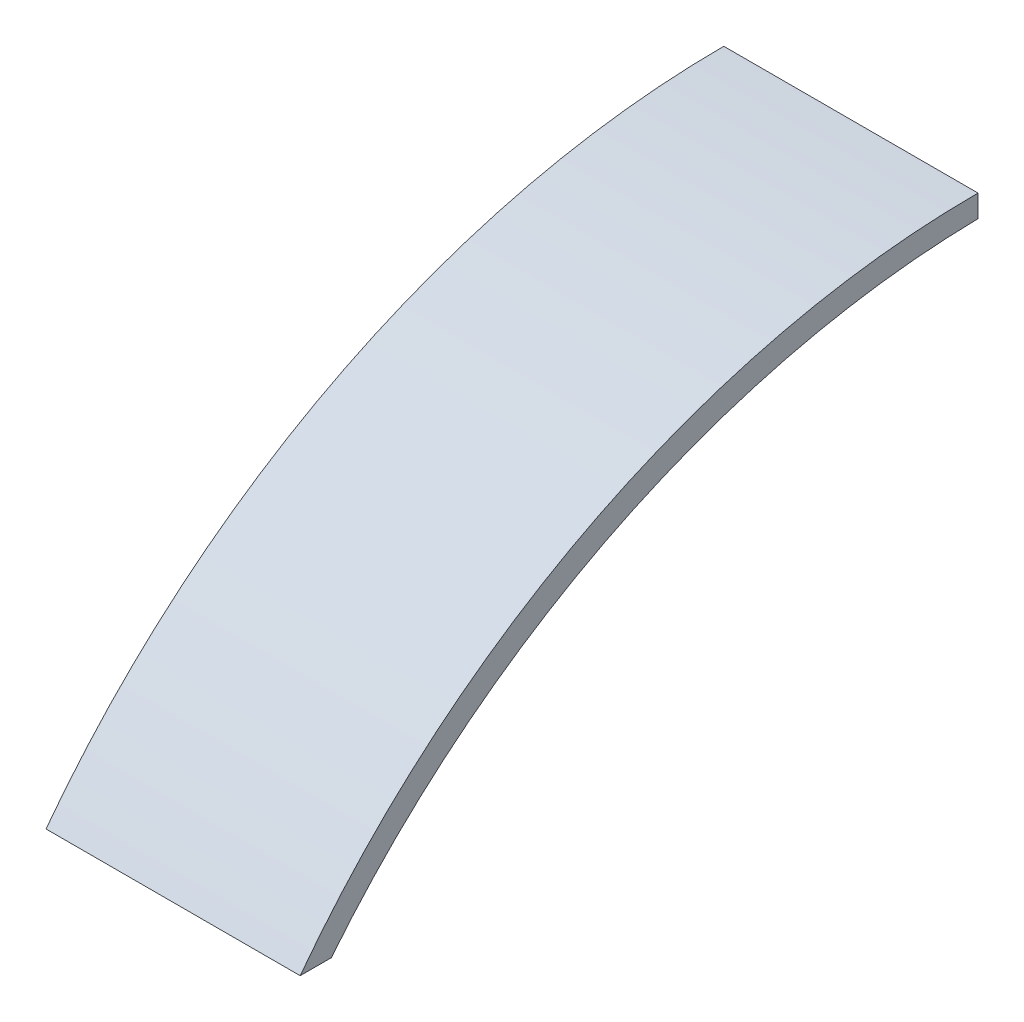
ISO-10303-21;
HEADER;
FILE_DESCRIPTION(('STEP AP214'),'2;1');
FILE_NAME('part.step','',(''),(''),'','','');
FILE_SCHEMA(('AUTOMOTIVE_DESIGN { 1 0 10303 214 1 1 1 1 }'));
ENDSEC;
DATA;
#1=APPLICATION_CONTEXT('core data for automotive mechanical design processes');
#2=APPLICATION_PROTOCOL_DEFINITION('international standard','automotive_design',2000,#1);
#3=PRODUCT_CONTEXT('',#1,'mechanical');
#4=PRODUCT('Part','Part','',(#3));
#5=PRODUCT_RELATED_PRODUCT_CATEGORY('part','',(#4));
#6=PRODUCT_DEFINITION_FORMATION('','',#4);
#7=PRODUCT_DEFINITION_CONTEXT('part definition',#1,'design');
#8=PRODUCT_DEFINITION('design','',#6,#7);
#9=PRODUCT_DEFINITION_SHAPE('','',#8);
#10=(LENGTH_UNIT() NAMED_UNIT(*) SI_UNIT(.MILLI.,.METRE.));
#11=(NAMED_UNIT(*) PLANE_ANGLE_UNIT() SI_UNIT($,.RADIAN.));
#12=(NAMED_UNIT(*) SI_UNIT($,.STERADIAN.) SOLID_ANGLE_UNIT());
#13=UNCERTAINTY_MEASURE_WITH_UNIT(LENGTH_MEASURE(1.E-05),#10,'distance_accuracy_value','');
#14=(GEOMETRIC_REPRESENTATION_CONTEXT(3) GLOBAL_UNCERTAINTY_ASSIGNED_CONTEXT((#13)) GLOBAL_UNIT_ASSIGNED_CONTEXT((#10,
#11,#12)) REPRESENTATION_CONTEXT('',''));
#15=CARTESIAN_POINT('',(0.,0.,0.));
#16=DIRECTION('',(0.,0.,1.));
#17=DIRECTION('',(1.,0.,0.));
#18=AXIS2_PLACEMENT_3D('',#15,#16,#17);
#19=CARTESIAN_POINT('',(57.15,0.,0.));
#20=DIRECTION('',(0.,1.,0.));
#21=DIRECTION('',(0.,0.,1.));
#22=AXIS2_PLACEMENT_3D('',#19,#20,#21);
#23=PLANE('',#22);
#24=DIRECTION('',(0.,0.,-1.));
#25=VECTOR('',#24,1.);
#26=CARTESIAN_POINT('',(0.,0.,0.));
#27=LINE('',#26,#25);
#28=CARTESIAN_POINT('',(0.,0.,0.));
#29=VERTEX_POINT('',#28);
#30=CARTESIAN_POINT('',(0.,0.,-7.00000000000001));
#31=VERTEX_POINT('',#30);
#32=EDGE_CURVE('E107',#29,#31,#27,.T.);
#33=ORIENTED_EDGE('',*,*,#32,.T.);
#34=DIRECTION('',(-1.,0.,0.));
#35=VECTOR('',#34,1.);
#36=CARTESIAN_POINT('',(57.15,0.,-7.00000000000001));
#37=LINE('',#36,#35);
#38=CARTESIAN_POINT('',(57.15,0.,-7.00000000000001));
#39=VERTEX_POINT('',#38);
#40=EDGE_CURVE('E11',#39,#31,#37,.T.);
#41=ORIENTED_EDGE('',*,*,#40,.F.);
#42=DIRECTION('',(0.,0.,-1.));
#43=VECTOR('',#42,1.);
#44=CARTESIAN_POINT('',(57.15,0.,0.));
#45=LINE('',#44,#43);
#46=CARTESIAN_POINT('',(57.15,0.,0.));
#47=VERTEX_POINT('',#46);
#48=EDGE_CURVE('E89',#47,#39,#45,.T.);
#49=ORIENTED_EDGE('',*,*,#48,.F.);
#50=DIRECTION('',(-1.,0.,0.));
#51=VECTOR('',#50,1.);
#52=CARTESIAN_POINT('',(57.15,0.,0.));
#53=LINE('',#52,#51);
#54=EDGE_CURVE('E56',#47,#29,#53,.T.);
#55=ORIENTED_EDGE('',*,*,#54,.T.);
#56=EDGE_LOOP('',(#33,#41,#49,#55));
#57=FACE_BOUND('',#56,.T.);
#58=ADVANCED_FACE('F39',(#57),#23,.F.);
#59=CARTESIAN_POINT('',(57.15,-119.274131121308,-155.53932693148));
#60=DIRECTION('',(-1.,0.,0.));
#61=DIRECTION('',(0.,0.,1.));
#62=AXIS2_PLACEMENT_3D('',#59,#60,#61);
#63=CYLINDRICAL_SURFACE('',#62,190.5);
#64=CARTESIAN_POINT('',(0.,-119.274131121308,-155.53932693148));
#65=DIRECTION('',(-1.,0.,0.));
#66=DIRECTION('',(0.,0.,1.));
#67=AXIS2_PLACEMENT_3D('',#64,#65,#66);
#68=CIRCLE('',#67,190.5);
#69=CARTESIAN_POINT('',(0.,71.1999999999999,-152.4));
#70=VERTEX_POINT('',#69);
#71=EDGE_CURVE('E95',#31,#70,#68,.T.);
#72=ORIENTED_EDGE('',*,*,#71,.T.);
#73=DIRECTION('',(-1.,0.,0.));
#74=VECTOR('',#73,1.);
#75=CARTESIAN_POINT('',(57.15,71.1999999999999,-152.4));
#76=LINE('',#75,#74);
#77=CARTESIAN_POINT('',(57.15,71.1999999999999,-152.4));
#78=VERTEX_POINT('',#77);
#79=EDGE_CURVE('E48',#78,#70,#76,.T.);
#80=ORIENTED_EDGE('',*,*,#79,.F.);
#81=CARTESIAN_POINT('',(57.15,-119.274131121308,-155.53932693148));
#82=DIRECTION('',(-1.,0.,0.));
#83=DIRECTION('',(0.,0.,1.));
#84=AXIS2_PLACEMENT_3D('',#81,#82,#83);
#85=CIRCLE('',#84,190.5);
#86=EDGE_CURVE('E81',#39,#78,#85,.T.);
#87=ORIENTED_EDGE('',*,*,#86,.F.);
#88=ORIENTED_EDGE('',*,*,#40,.T.);
#89=EDGE_LOOP('',(#72,#80,#87,#88));
#90=FACE_BOUND('',#89,.T.);
#91=ADVANCED_FACE('F94',(#90),#63,.F.);
#92=CARTESIAN_POINT('',(57.15,76.1999999999999,-152.4));
#93=DIRECTION('',(0.,0.,-1.));
#94=DIRECTION('',(0.,1.,0.));
#95=AXIS2_PLACEMENT_3D('',#92,#93,#94);
#96=PLANE('',#95);
#97=DIRECTION('',(0.,-1.,0.));
#98=VECTOR('',#97,1.);
#99=CARTESIAN_POINT('',(0.,76.1999999999999,-152.4));
#100=LINE('',#99,#98);
#101=CARTESIAN_POINT('',(0.,76.1999999999999,-152.4));
#102=VERTEX_POINT('',#101);
#103=EDGE_CURVE('E112',#102,#70,#100,.T.);
#104=ORIENTED_EDGE('',*,*,#103,.F.);
#105=DIRECTION('',(-1.,0.,0.));
#106=VECTOR('',#105,1.);
#107=CARTESIAN_POINT('',(57.15,76.1999999999999,-152.4));
#108=LINE('',#107,#106);
#109=CARTESIAN_POINT('',(57.15,76.1999999999999,-152.4));
#110=VERTEX_POINT('',#109);
#111=EDGE_CURVE('E70',#110,#102,#108,.T.);
#112=ORIENTED_EDGE('',*,*,#111,.F.);
#113=DIRECTION('',(0.,-1.,0.));
#114=VECTOR('',#113,1.);
#115=CARTESIAN_POINT('',(57.15,76.1999999999999,-152.4));
#116=LINE('',#115,#114);
#117=EDGE_CURVE('E88',#110,#78,#116,.T.);
#118=ORIENTED_EDGE('',*,*,#117,.T.);
#119=ORIENTED_EDGE('',*,*,#79,.T.);
#120=EDGE_LOOP('',(#104,#112,#118,#119));
#121=FACE_BOUND('',#120,.T.);
#122=ADVANCED_FACE('F99',(#121),#96,.T.);
#123=CARTESIAN_POINT('',(57.15,-114.3,-152.4));
#124=DIRECTION('',(-1.,0.,0.));
#125=DIRECTION('',(0.,0.,1.));
#126=AXIS2_PLACEMENT_3D('',#123,#124,#125);
#127=CYLINDRICAL_SURFACE('',#126,190.5);
#128=CARTESIAN_POINT('',(0.,-114.3,-152.4));
#129=DIRECTION('',(-1.,0.,0.));
#130=DIRECTION('',(0.,0.,1.));
#131=AXIS2_PLACEMENT_3D('',#128,#129,#130);
#132=CIRCLE('',#131,190.5);
#133=EDGE_CURVE('E115',#29,#102,#132,.T.);
#134=ORIENTED_EDGE('',*,*,#133,.F.);
#135=ORIENTED_EDGE('',*,*,#54,.F.);
#136=CARTESIAN_POINT('',(57.15,-114.3,-152.4));
#137=DIRECTION('',(-1.,0.,0.));
#138=DIRECTION('',(0.,0.,1.));
#139=AXIS2_PLACEMENT_3D('',#136,#137,#138);
#140=CIRCLE('',#139,190.5);
#141=EDGE_CURVE('E101',#47,#110,#140,.T.);
#142=ORIENTED_EDGE('',*,*,#141,.T.);
#143=ORIENTED_EDGE('',*,*,#111,.T.);
#144=EDGE_LOOP('',(#134,#135,#142,#143));
#145=FACE_BOUND('',#144,.T.);
#146=ADVANCED_FACE('F125',(#145),#127,.T.);
#147=CARTESIAN_POINT('',(57.15,-119.274131121308,-155.53932693148));
#148=DIRECTION('',(-1.,0.,0.));
#149=DIRECTION('',(0.,0.,1.));
#150=AXIS2_PLACEMENT_3D('',#147,#148,#149);
#151=PLANE('',#150);
#152=ORIENTED_EDGE('',*,*,#48,.T.);
#153=ORIENTED_EDGE('',*,*,#86,.T.);
#154=ORIENTED_EDGE('',*,*,#117,.F.);
#155=ORIENTED_EDGE('',*,*,#141,.F.);
#156=EDGE_LOOP('',(#152,#153,#154,#155));
#157=FACE_BOUND('',#156,.T.);
#158=ADVANCED_FACE('F85',(#157),#151,.F.);
#159=CARTESIAN_POINT('',(0.,-119.274131121308,-155.53932693148));
#160=DIRECTION('',(-1.,0.,0.));
#161=DIRECTION('',(0.,0.,1.));
#162=AXIS2_PLACEMENT_3D('',#159,#160,#161);
#163=PLANE('',#162);
#164=ORIENTED_EDGE('',*,*,#32,.F.);
#165=ORIENTED_EDGE('',*,*,#133,.T.);
#166=ORIENTED_EDGE('',*,*,#103,.T.);
#167=ORIENTED_EDGE('',*,*,#71,.F.);
#168=EDGE_LOOP('',(#164,#165,#166,#167));
#169=FACE_BOUND('',#168,.T.);
#170=ADVANCED_FACE('F124',(#169),#163,.T.);
#171=CLOSED_SHELL('',(#58,#91,#122,#146,#158,#170));
#172=MANIFOLD_SOLID_BREP('B2',#171);
#173=ADVANCED_BREP_SHAPE_REPRESENTATION('',(#18,#172),#14);
#174=SHAPE_DEFINITION_REPRESENTATION(#9,#173);
ENDSEC;
END-ISO-10303-21;
